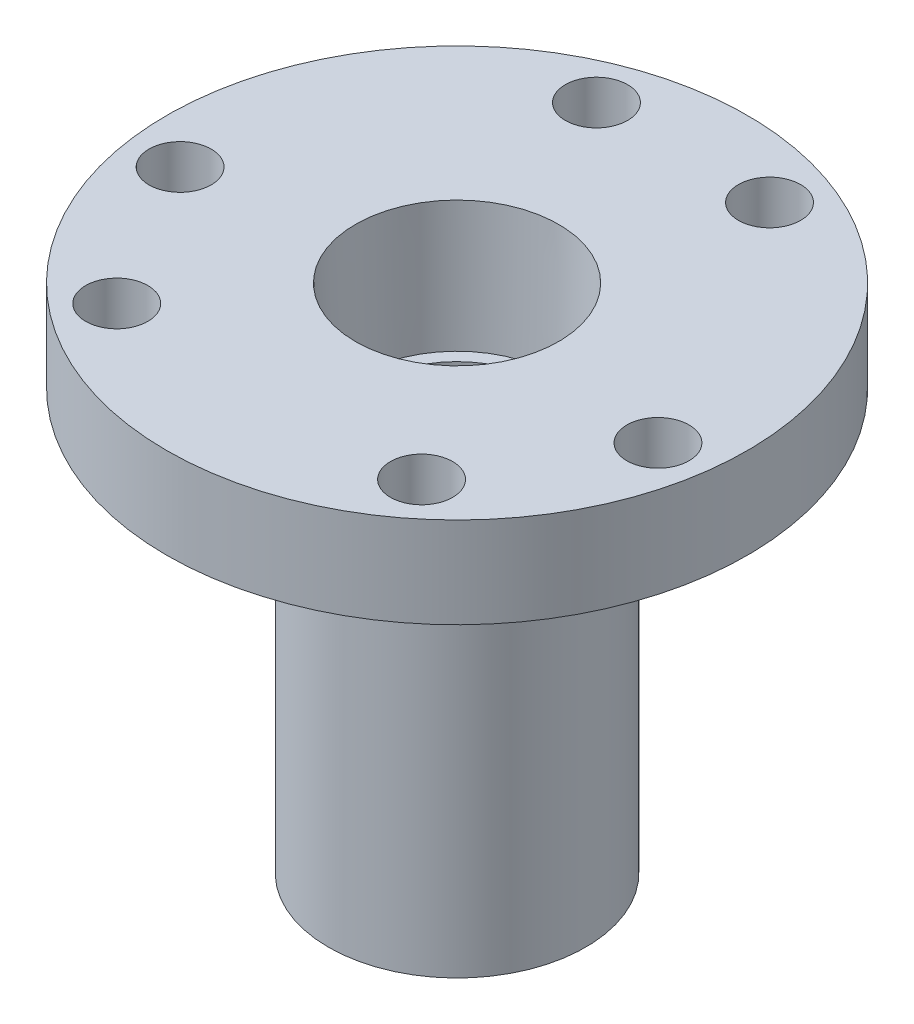
ISO-10303-21;
HEADER;
FILE_DESCRIPTION(('STEP AP214'),'2;1');
FILE_NAME('part.step','',(''),(''),'','','');
FILE_SCHEMA(('AUTOMOTIVE_DESIGN { 1 0 10303 214 1 1 1 1 }'));
ENDSEC;
DATA;
#1=APPLICATION_CONTEXT('core data for automotive mechanical design processes');
#2=APPLICATION_PROTOCOL_DEFINITION('international standard','automotive_design',2000,#1);
#3=PRODUCT_CONTEXT('',#1,'mechanical');
#4=PRODUCT('Part','Part','',(#3));
#5=PRODUCT_RELATED_PRODUCT_CATEGORY('part','',(#4));
#6=PRODUCT_DEFINITION_FORMATION('','',#4);
#7=PRODUCT_DEFINITION_CONTEXT('part definition',#1,'design');
#8=PRODUCT_DEFINITION('design','',#6,#7);
#9=PRODUCT_DEFINITION_SHAPE('','',#8);
#10=(LENGTH_UNIT() NAMED_UNIT(*) SI_UNIT(.MILLI.,.METRE.));
#11=(NAMED_UNIT(*) PLANE_ANGLE_UNIT() SI_UNIT($,.RADIAN.));
#12=(NAMED_UNIT(*) SI_UNIT($,.STERADIAN.) SOLID_ANGLE_UNIT());
#13=UNCERTAINTY_MEASURE_WITH_UNIT(LENGTH_MEASURE(1.E-05),#10,'distance_accuracy_value','');
#14=(GEOMETRIC_REPRESENTATION_CONTEXT(3) GLOBAL_UNCERTAINTY_ASSIGNED_CONTEXT((#13)) GLOBAL_UNIT_ASSIGNED_CONTEXT((#10,
#11,#12)) REPRESENTATION_CONTEXT('',''));
#15=CARTESIAN_POINT('',(0.,0.,0.));
#16=DIRECTION('',(0.,0.,1.));
#17=DIRECTION('',(1.,0.,0.));
#18=AXIS2_PLACEMENT_3D('',#15,#16,#17);
#19=CARTESIAN_POINT('',(12.7,0.,0.));
#20=DIRECTION('',(0.,-1.,0.));
#21=DIRECTION('',(0.,0.,-1.));
#22=AXIS2_PLACEMENT_3D('',#19,#20,#21);
#23=PLANE('',#22);
#24=CARTESIAN_POINT('',(0.,0.,0.));
#25=DIRECTION('',(0.,1.,0.));
#26=DIRECTION('',(0.,0.,1.));
#27=AXIS2_PLACEMENT_3D('',#24,#25,#26);
#28=CIRCLE('',#27,10.6647361);
#29=CARTESIAN_POINT('',(0.,0.,10.6647361));
#30=VERTEX_POINT('',#29);
#31=EDGE_CURVE('E109',#30,#30,#28,.T.);
#32=ORIENTED_EDGE('',*,*,#31,.F.);
#33=EDGE_LOOP('',(#32));
#34=FACE_BOUND('',#33,.T.);
#35=CARTESIAN_POINT('',(0.,0.,0.));
#36=DIRECTION('',(0.,1.,0.));
#37=DIRECTION('',(0.,0.,1.));
#38=AXIS2_PLACEMENT_3D('',#35,#36,#37);
#39=CIRCLE('',#38,30.48);
#40=CARTESIAN_POINT('',(0.,0.,30.48));
#41=VERTEX_POINT('',#40);
#42=EDGE_CURVE('E59',#41,#41,#39,.T.);
#43=ORIENTED_EDGE('',*,*,#42,.T.);
#44=EDGE_LOOP('',(#43));
#45=FACE_BOUND('',#44,.T.);
#46=CARTESIAN_POINT('',(9.08420322988462,0.,-23.7199757942152));
#47=DIRECTION('',(0.,1.,0.));
#48=DIRECTION('',(0.,0.,1.));
#49=AXIS2_PLACEMENT_3D('',#46,#47,#48);
#50=CIRCLE('',#49,3.2639);
#51=CARTESIAN_POINT('',(9.08420322988462,0.,-20.4560757942152));
#52=VERTEX_POINT('',#51);
#53=EDGE_CURVE('E70',#52,#52,#50,.T.);
#54=ORIENTED_EDGE('',*,*,#53,.F.);
#55=EDGE_LOOP('',(#54));
#56=FACE_BOUND('',#55,.T.);
#57=CARTESIAN_POINT('',(-9.08420322988462,0.,-23.7199757942152));
#58=DIRECTION('',(0.,1.,0.));
#59=DIRECTION('',(0.,0.,1.));
#60=AXIS2_PLACEMENT_3D('',#57,#58,#59);
#61=CIRCLE('',#60,3.2639);
#62=CARTESIAN_POINT('',(-9.08420322988462,0.,-20.4560757942152));
#63=VERTEX_POINT('',#62);
#64=EDGE_CURVE('E76',#63,#63,#61,.T.);
#65=ORIENTED_EDGE('',*,*,#64,.F.);
#66=EDGE_LOOP('',(#65));
#67=FACE_BOUND('',#66,.T.);
#68=CARTESIAN_POINT('',(-25.0842032298846,0.,3.99283712688686));
#69=DIRECTION('',(0.,1.,0.));
#70=DIRECTION('',(0.,0.,1.));
#71=AXIS2_PLACEMENT_3D('',#68,#69,#70);
#72=CIRCLE('',#71,3.2639);
#73=CARTESIAN_POINT('',(-25.0842032298846,0.,7.25673712688686));
#74=VERTEX_POINT('',#73);
#75=EDGE_CURVE('E82',#74,#74,#72,.T.);
#76=ORIENTED_EDGE('',*,*,#75,.F.);
#77=EDGE_LOOP('',(#76));
#78=FACE_BOUND('',#77,.T.);
#79=CARTESIAN_POINT('',(-16.,0.,19.7271386673283));
#80=DIRECTION('',(0.,1.,0.));
#81=DIRECTION('',(0.,0.,1.));
#82=AXIS2_PLACEMENT_3D('',#79,#80,#81);
#83=CIRCLE('',#82,3.2639);
#84=CARTESIAN_POINT('',(-16.,0.,22.9910386673283));
#85=VERTEX_POINT('',#84);
#86=EDGE_CURVE('E88',#85,#85,#83,.T.);
#87=ORIENTED_EDGE('',*,*,#86,.F.);
#88=EDGE_LOOP('',(#87));
#89=FACE_BOUND('',#88,.T.);
#90=CARTESIAN_POINT('',(16.,0.,19.7271386673283));
#91=DIRECTION('',(0.,1.,0.));
#92=DIRECTION('',(0.,0.,1.));
#93=AXIS2_PLACEMENT_3D('',#90,#91,#92);
#94=CIRCLE('',#93,3.2639);
#95=CARTESIAN_POINT('',(16.,0.,22.9910386673283));
#96=VERTEX_POINT('',#95);
#97=EDGE_CURVE('E94',#96,#96,#94,.T.);
#98=ORIENTED_EDGE('',*,*,#97,.F.);
#99=EDGE_LOOP('',(#98));
#100=FACE_BOUND('',#99,.T.);
#101=CARTESIAN_POINT('',(25.0842032298846,0.,3.99283712688686));
#102=DIRECTION('',(0.,1.,0.));
#103=DIRECTION('',(0.,0.,1.));
#104=AXIS2_PLACEMENT_3D('',#101,#102,#103);
#105=CIRCLE('',#104,3.2639);
#106=CARTESIAN_POINT('',(25.0842032298846,0.,7.25673712688686));
#107=VERTEX_POINT('',#106);
#108=EDGE_CURVE('E100',#107,#107,#105,.T.);
#109=ORIENTED_EDGE('',*,*,#108,.F.);
#110=EDGE_LOOP('',(#109));
#111=FACE_BOUND('',#110,.T.);
#112=ADVANCED_FACE('F47',(#34,#45,#56,#67,#78,#89,#100,#111),#23,.F.);
#113=CARTESIAN_POINT('',(13.5,-53.65,0.));
#114=DIRECTION('',(0.,1.,0.));
#115=DIRECTION('',(0.,0.,1.));
#116=AXIS2_PLACEMENT_3D('',#113,#114,#115);
#117=PLANE('',#116);
#118=CARTESIAN_POINT('',(0.,-53.65,0.));
#119=DIRECTION('',(0.,-1.,0.));
#120=DIRECTION('',(0.,0.,-1.));
#121=AXIS2_PLACEMENT_3D('',#118,#119,#120);
#122=CIRCLE('',#121,10.6647361);
#123=CARTESIAN_POINT('',(0.,-53.65,-10.6647361));
#124=VERTEX_POINT('',#123);
#125=EDGE_CURVE('E118',#124,#124,#122,.T.);
#126=ORIENTED_EDGE('',*,*,#125,.F.);
#127=EDGE_LOOP('',(#126));
#128=FACE_BOUND('',#127,.T.);
#129=CARTESIAN_POINT('',(0.,-53.65,0.));
#130=DIRECTION('',(0.,1.,0.));
#131=DIRECTION('',(0.,0.,1.));
#132=AXIS2_PLACEMENT_3D('',#129,#130,#131);
#133=CIRCLE('',#132,13.5);
#134=CARTESIAN_POINT('',(0.,-53.65,13.5));
#135=VERTEX_POINT('',#134);
#136=EDGE_CURVE('E51',#135,#135,#133,.T.);
#137=ORIENTED_EDGE('',*,*,#136,.F.);
#138=EDGE_LOOP('',(#137));
#139=FACE_BOUND('',#138,.T.);
#140=ADVANCED_FACE('F49',(#128,#139),#117,.F.);
#141=CARTESIAN_POINT('',(0.,0.,0.));
#142=DIRECTION('',(0.,1.,0.));
#143=DIRECTION('',(0.,0.,1.));
#144=AXIS2_PLACEMENT_3D('',#141,#142,#143);
#145=CYLINDRICAL_SURFACE('',#144,30.48);
#146=ORIENTED_EDGE('',*,*,#42,.F.);
#147=EDGE_LOOP('',(#146));
#148=FACE_BOUND('',#147,.T.);
#149=CARTESIAN_POINT('',(0.,-9.525,0.));
#150=DIRECTION('',(0.,1.,0.));
#151=DIRECTION('',(0.,0.,1.));
#152=AXIS2_PLACEMENT_3D('',#149,#150,#151);
#153=CIRCLE('',#152,30.48);
#154=CARTESIAN_POINT('',(0.,-9.525,30.48));
#155=VERTEX_POINT('',#154);
#156=EDGE_CURVE('E64',#155,#155,#153,.T.);
#157=ORIENTED_EDGE('',*,*,#156,.T.);
#158=EDGE_LOOP('',(#157));
#159=FACE_BOUND('',#158,.T.);
#160=ADVANCED_FACE('F126',(#148,#159),#145,.T.);
#161=CARTESIAN_POINT('',(30.48,-9.525,0.));
#162=DIRECTION('',(0.,1.,0.));
#163=DIRECTION('',(0.,0.,1.));
#164=AXIS2_PLACEMENT_3D('',#161,#162,#163);
#165=PLANE('',#164);
#166=CARTESIAN_POINT('',(25.0842032298846,-9.525,3.99283712688686));
#167=DIRECTION('',(0.,1.,0.));
#168=DIRECTION('',(0.,0.,1.));
#169=AXIS2_PLACEMENT_3D('',#166,#167,#168);
#170=CIRCLE('',#169,3.2639);
#171=CARTESIAN_POINT('',(25.0842032298846,-9.525,7.25673712688686));
#172=VERTEX_POINT('',#171);
#173=EDGE_CURVE('E97',#172,#172,#170,.T.);
#174=ORIENTED_EDGE('',*,*,#173,.T.);
#175=EDGE_LOOP('',(#174));
#176=FACE_BOUND('',#175,.T.);
#177=CARTESIAN_POINT('',(16.,-9.525,19.7271386673283));
#178=DIRECTION('',(0.,1.,0.));
#179=DIRECTION('',(0.,0.,1.));
#180=AXIS2_PLACEMENT_3D('',#177,#178,#179);
#181=CIRCLE('',#180,3.2639);
#182=CARTESIAN_POINT('',(16.,-9.525,22.9910386673283));
#183=VERTEX_POINT('',#182);
#184=EDGE_CURVE('E91',#183,#183,#181,.T.);
#185=ORIENTED_EDGE('',*,*,#184,.T.);
#186=EDGE_LOOP('',(#185));
#187=FACE_BOUND('',#186,.T.);
#188=CARTESIAN_POINT('',(-16.,-9.525,19.7271386673283));
#189=DIRECTION('',(0.,1.,0.));
#190=DIRECTION('',(0.,0.,1.));
#191=AXIS2_PLACEMENT_3D('',#188,#189,#190);
#192=CIRCLE('',#191,3.26389999999999);
#193=CARTESIAN_POINT('',(-16.,-9.525,22.9910386673283));
#194=VERTEX_POINT('',#193);
#195=EDGE_CURVE('E85',#194,#194,#192,.T.);
#196=ORIENTED_EDGE('',*,*,#195,.T.);
#197=EDGE_LOOP('',(#196));
#198=FACE_BOUND('',#197,.T.);
#199=CARTESIAN_POINT('',(-25.0842032298846,-9.525,3.99283712688686));
#200=DIRECTION('',(0.,1.,0.));
#201=DIRECTION('',(0.,0.,1.));
#202=AXIS2_PLACEMENT_3D('',#199,#200,#201);
#203=CIRCLE('',#202,3.2639);
#204=CARTESIAN_POINT('',(-25.0842032298846,-9.525,7.25673712688686));
#205=VERTEX_POINT('',#204);
#206=EDGE_CURVE('E79',#205,#205,#203,.T.);
#207=ORIENTED_EDGE('',*,*,#206,.T.);
#208=EDGE_LOOP('',(#207));
#209=FACE_BOUND('',#208,.T.);
#210=CARTESIAN_POINT('',(-9.08420322988462,-9.525,-23.7199757942152));
#211=DIRECTION('',(0.,1.,0.));
#212=DIRECTION('',(0.,0.,1.));
#213=AXIS2_PLACEMENT_3D('',#210,#211,#212);
#214=CIRCLE('',#213,3.26389999999999);
#215=CARTESIAN_POINT('',(-9.08420322988462,-9.525,-20.4560757942152));
#216=VERTEX_POINT('',#215);
#217=EDGE_CURVE('E73',#216,#216,#214,.T.);
#218=ORIENTED_EDGE('',*,*,#217,.T.);
#219=EDGE_LOOP('',(#218));
#220=FACE_BOUND('',#219,.T.);
#221=CARTESIAN_POINT('',(9.08420322988462,-9.525,-23.7199757942152));
#222=DIRECTION('',(0.,1.,0.));
#223=DIRECTION('',(0.,0.,1.));
#224=AXIS2_PLACEMENT_3D('',#221,#222,#223);
#225=CIRCLE('',#224,3.26389999999999);
#226=CARTESIAN_POINT('',(9.08420322988462,-9.525,-20.4560757942152));
#227=VERTEX_POINT('',#226);
#228=EDGE_CURVE('E67',#227,#227,#225,.T.);
#229=ORIENTED_EDGE('',*,*,#228,.T.);
#230=EDGE_LOOP('',(#229));
#231=FACE_BOUND('',#230,.T.);
#232=CARTESIAN_POINT('',(0.,-9.525,0.));
#233=DIRECTION('',(0.,1.,0.));
#234=DIRECTION('',(0.,0.,1.));
#235=AXIS2_PLACEMENT_3D('',#232,#233,#234);
#236=CIRCLE('',#235,16.675);
#237=CARTESIAN_POINT('',(0.,-9.525,16.675));
#238=VERTEX_POINT('',#237);
#239=EDGE_CURVE('E55',#238,#238,#236,.T.);
#240=ORIENTED_EDGE('',*,*,#239,.T.);
#241=EDGE_LOOP('',(#240));
#242=FACE_BOUND('',#241,.T.);
#243=ORIENTED_EDGE('',*,*,#156,.F.);
#244=EDGE_LOOP('',(#243));
#245=FACE_BOUND('',#244,.T.);
#246=ADVANCED_FACE('F133',(#176,#187,#198,#209,#220,#231,#242,#245),#165,.F.);
#247=CARTESIAN_POINT('',(0.,0.,0.));
#248=DIRECTION('',(0.,1.,0.));
#249=DIRECTION('',(0.,0.,1.));
#250=AXIS2_PLACEMENT_3D('',#247,#248,#249);
#251=CYLINDRICAL_SURFACE('',#250,13.5);
#252=ORIENTED_EDGE('',*,*,#136,.T.);
#253=EDGE_LOOP('',(#252));
#254=FACE_BOUND('',#253,.T.);
#255=CARTESIAN_POINT('',(0.,-12.7,0.));
#256=DIRECTION('',(0.,1.,0.));
#257=DIRECTION('',(0.,0.,1.));
#258=AXIS2_PLACEMENT_3D('',#255,#256,#257);
#259=CIRCLE('',#258,13.5);
#260=CARTESIAN_POINT('',(0.,-12.7,13.5));
#261=VERTEX_POINT('',#260);
#262=EDGE_CURVE('E13',#261,#261,#259,.F.);
#263=ORIENTED_EDGE('',*,*,#262,.T.);
#264=EDGE_LOOP('',(#263));
#265=FACE_BOUND('',#264,.T.);
#266=ADVANCED_FACE('F130',(#254,#265),#251,.T.);
#267=CARTESIAN_POINT('',(0.,-9.525,0.));
#268=DIRECTION('',(0.,1.,0.));
#269=DIRECTION('',(0.,0.,1.));
#270=AXIS2_PLACEMENT_3D('',#267,#268,#269);
#271=CONICAL_SURFACE('',#270,16.675,0.785398163397453);
#272=ORIENTED_EDGE('',*,*,#262,.F.);
#273=EDGE_LOOP('',(#272));
#274=FACE_BOUND('',#273,.T.);
#275=ORIENTED_EDGE('',*,*,#239,.F.);
#276=EDGE_LOOP('',(#275));
#277=FACE_BOUND('',#276,.T.);
#278=ADVANCED_FACE('F132',(#274,#277),#271,.T.);
#279=CARTESIAN_POINT('',(9.08420322988462,0.,-23.7199757942152));
#280=DIRECTION('',(0.,1.,0.));
#281=DIRECTION('',(0.,0.,1.));
#282=AXIS2_PLACEMENT_3D('',#279,#280,#281);
#283=CYLINDRICAL_SURFACE('',#282,3.26389999999999);
#284=ORIENTED_EDGE('',*,*,#53,.T.);
#285=EDGE_LOOP('',(#284));
#286=FACE_BOUND('',#285,.T.);
#287=ORIENTED_EDGE('',*,*,#228,.F.);
#288=EDGE_LOOP('',(#287));
#289=FACE_BOUND('',#288,.T.);
#290=ADVANCED_FACE('F139',(#286,#289),#283,.F.);
#291=CARTESIAN_POINT('',(-9.08420322988462,0.,-23.7199757942152));
#292=DIRECTION('',(0.,1.,0.));
#293=DIRECTION('',(0.,0.,1.));
#294=AXIS2_PLACEMENT_3D('',#291,#292,#293);
#295=CYLINDRICAL_SURFACE('',#294,3.26389999999999);
#296=ORIENTED_EDGE('',*,*,#64,.T.);
#297=EDGE_LOOP('',(#296));
#298=FACE_BOUND('',#297,.T.);
#299=ORIENTED_EDGE('',*,*,#217,.F.);
#300=EDGE_LOOP('',(#299));
#301=FACE_BOUND('',#300,.T.);
#302=ADVANCED_FACE('F195',(#298,#301),#295,.F.);
#303=CARTESIAN_POINT('',(-25.0842032298846,0.,3.99283712688686));
#304=DIRECTION('',(0.,1.,0.));
#305=DIRECTION('',(0.,0.,1.));
#306=AXIS2_PLACEMENT_3D('',#303,#304,#305);
#307=CYLINDRICAL_SURFACE('',#306,3.2639);
#308=ORIENTED_EDGE('',*,*,#75,.T.);
#309=EDGE_LOOP('',(#308));
#310=FACE_BOUND('',#309,.T.);
#311=ORIENTED_EDGE('',*,*,#206,.F.);
#312=EDGE_LOOP('',(#311));
#313=FACE_BOUND('',#312,.T.);
#314=ADVANCED_FACE('F191',(#310,#313),#307,.F.);
#315=CARTESIAN_POINT('',(-16.,0.,19.7271386673283));
#316=DIRECTION('',(0.,1.,0.));
#317=DIRECTION('',(0.,0.,1.));
#318=AXIS2_PLACEMENT_3D('',#315,#316,#317);
#319=CYLINDRICAL_SURFACE('',#318,3.26389999999999);
#320=ORIENTED_EDGE('',*,*,#86,.T.);
#321=EDGE_LOOP('',(#320));
#322=FACE_BOUND('',#321,.T.);
#323=ORIENTED_EDGE('',*,*,#195,.F.);
#324=EDGE_LOOP('',(#323));
#325=FACE_BOUND('',#324,.T.);
#326=ADVANCED_FACE('F187',(#322,#325),#319,.F.);
#327=CARTESIAN_POINT('',(16.,0.,19.7271386673283));
#328=DIRECTION('',(0.,1.,0.));
#329=DIRECTION('',(0.,0.,1.));
#330=AXIS2_PLACEMENT_3D('',#327,#328,#329);
#331=CYLINDRICAL_SURFACE('',#330,3.2639);
#332=ORIENTED_EDGE('',*,*,#97,.T.);
#333=EDGE_LOOP('',(#332));
#334=FACE_BOUND('',#333,.T.);
#335=ORIENTED_EDGE('',*,*,#184,.F.);
#336=EDGE_LOOP('',(#335));
#337=FACE_BOUND('',#336,.T.);
#338=ADVANCED_FACE('F165',(#334,#337),#331,.F.);
#339=CARTESIAN_POINT('',(25.0842032298846,0.,3.99283712688686));
#340=DIRECTION('',(0.,1.,0.));
#341=DIRECTION('',(0.,0.,1.));
#342=AXIS2_PLACEMENT_3D('',#339,#340,#341);
#343=CYLINDRICAL_SURFACE('',#342,3.2639);
#344=ORIENTED_EDGE('',*,*,#108,.T.);
#345=EDGE_LOOP('',(#344));
#346=FACE_BOUND('',#345,.T.);
#347=ORIENTED_EDGE('',*,*,#173,.F.);
#348=EDGE_LOOP('',(#347));
#349=FACE_BOUND('',#348,.T.);
#350=ADVANCED_FACE('F156',(#346,#349),#343,.F.);
#351=CARTESIAN_POINT('',(0.,0.,0.));
#352=DIRECTION('',(0.,1.,0.));
#353=DIRECTION('',(0.,0.,1.));
#354=AXIS2_PLACEMENT_3D('',#351,#352,#353);
#355=CYLINDRICAL_SURFACE('',#354,8.9281);
#356=CARTESIAN_POINT('',(0.,-40.188,0.));
#357=DIRECTION('',(0.,-1.,0.));
#358=DIRECTION('',(0.,0.,-1.));
#359=AXIS2_PLACEMENT_3D('',#356,#357,#358);
#360=CIRCLE('',#359,8.9281);
#361=CARTESIAN_POINT('',(0.,-40.188,-8.9281));
#362=VERTEX_POINT('',#361);
#363=EDGE_CURVE('E112',#362,#362,#360,.T.);
#364=ORIENTED_EDGE('',*,*,#363,.T.);
#365=EDGE_LOOP('',(#364));
#366=FACE_BOUND('',#365,.T.);
#367=CARTESIAN_POINT('',(0.,-13.462,0.));
#368=DIRECTION('',(0.,1.,0.));
#369=DIRECTION('',(0.,0.,1.));
#370=AXIS2_PLACEMENT_3D('',#367,#368,#369);
#371=CIRCLE('',#370,8.9281);
#372=CARTESIAN_POINT('',(0.,-13.462,8.9281));
#373=VERTEX_POINT('',#372);
#374=EDGE_CURVE('E103',#373,#373,#371,.T.);
#375=ORIENTED_EDGE('',*,*,#374,.T.);
#376=EDGE_LOOP('',(#375));
#377=FACE_BOUND('',#376,.T.);
#378=ADVANCED_FACE('F153',(#366,#377),#355,.F.);
#379=CARTESIAN_POINT('',(8.9281,-13.462,0.));
#380=DIRECTION('',(0.,-1.,0.));
#381=DIRECTION('',(0.,0.,-1.));
#382=AXIS2_PLACEMENT_3D('',#379,#380,#381);
#383=PLANE('',#382);
#384=ORIENTED_EDGE('',*,*,#374,.F.);
#385=EDGE_LOOP('',(#384));
#386=FACE_BOUND('',#385,.T.);
#387=CARTESIAN_POINT('',(0.,-13.462,0.));
#388=DIRECTION('',(0.,1.,0.));
#389=DIRECTION('',(0.,0.,1.));
#390=AXIS2_PLACEMENT_3D('',#387,#388,#389);
#391=CIRCLE('',#390,10.2616657920863);
#392=CARTESIAN_POINT('',(0.,-13.462,10.2616657920863));
#393=VERTEX_POINT('',#392);
#394=EDGE_CURVE('E106',#393,#393,#391,.T.);
#395=ORIENTED_EDGE('',*,*,#394,.T.);
#396=EDGE_LOOP('',(#395));
#397=FACE_BOUND('',#396,.T.);
#398=ADVANCED_FACE('F155',(#386,#397),#383,.F.);
#399=CARTESIAN_POINT('',(0.,0.,0.));
#400=DIRECTION('',(0.,1.,0.));
#401=DIRECTION('',(0.,0.,1.));
#402=AXIS2_PLACEMENT_3D('',#399,#400,#401);
#403=CONICAL_SURFACE('',#402,10.6647361,0.0299323966717032);
#404=ORIENTED_EDGE('',*,*,#394,.F.);
#405=EDGE_LOOP('',(#404));
#406=FACE_BOUND('',#405,.T.);
#407=ORIENTED_EDGE('',*,*,#31,.T.);
#408=EDGE_LOOP('',(#407));
#409=FACE_BOUND('',#408,.T.);
#410=ADVANCED_FACE('F162',(#406,#409),#403,.F.);
#411=CARTESIAN_POINT('',(8.9281,-40.188,0.));
#412=DIRECTION('',(0.,1.,0.));
#413=DIRECTION('',(0.,0.,1.));
#414=AXIS2_PLACEMENT_3D('',#411,#412,#413);
#415=PLANE('',#414);
#416=ORIENTED_EDGE('',*,*,#363,.F.);
#417=EDGE_LOOP('',(#416));
#418=FACE_BOUND('',#417,.T.);
#419=CARTESIAN_POINT('',(0.,-40.188,0.));
#420=DIRECTION('',(0.,-1.,0.));
#421=DIRECTION('',(0.,0.,-1.));
#422=AXIS2_PLACEMENT_3D('',#419,#420,#421);
#423=CIRCLE('',#422,10.2616657920863);
#424=CARTESIAN_POINT('',(0.,-40.188,-10.2616657920863));
#425=VERTEX_POINT('',#424);
#426=EDGE_CURVE('E115',#425,#425,#423,.T.);
#427=ORIENTED_EDGE('',*,*,#426,.T.);
#428=EDGE_LOOP('',(#427));
#429=FACE_BOUND('',#428,.T.);
#430=ADVANCED_FACE('F176',(#418,#429),#415,.F.);
#431=CARTESIAN_POINT('',(0.,-53.65,0.));
#432=DIRECTION('',(0.,-1.,0.));
#433=DIRECTION('',(0.,0.,-1.));
#434=AXIS2_PLACEMENT_3D('',#431,#432,#433);
#435=CONICAL_SURFACE('',#434,10.6647361,0.0299323966717031);
#436=ORIENTED_EDGE('',*,*,#426,.F.);
#437=EDGE_LOOP('',(#436));
#438=FACE_BOUND('',#437,.T.);
#439=ORIENTED_EDGE('',*,*,#125,.T.);
#440=EDGE_LOOP('',(#439));
#441=FACE_BOUND('',#440,.T.);
#442=ADVANCED_FACE('F122',(#438,#441),#435,.F.);
#443=CLOSED_SHELL('',(#112,#140,#160,#246,#266,#278,#290,#302,#314,#326,#338,#350,#378,#398,
#410,#430,#442));
#444=MANIFOLD_SOLID_BREP('B2',#443);
#445=ADVANCED_BREP_SHAPE_REPRESENTATION('',(#18,#444),#14);
#446=SHAPE_DEFINITION_REPRESENTATION(#9,#445);
ENDSEC;
END-ISO-10303-21;
